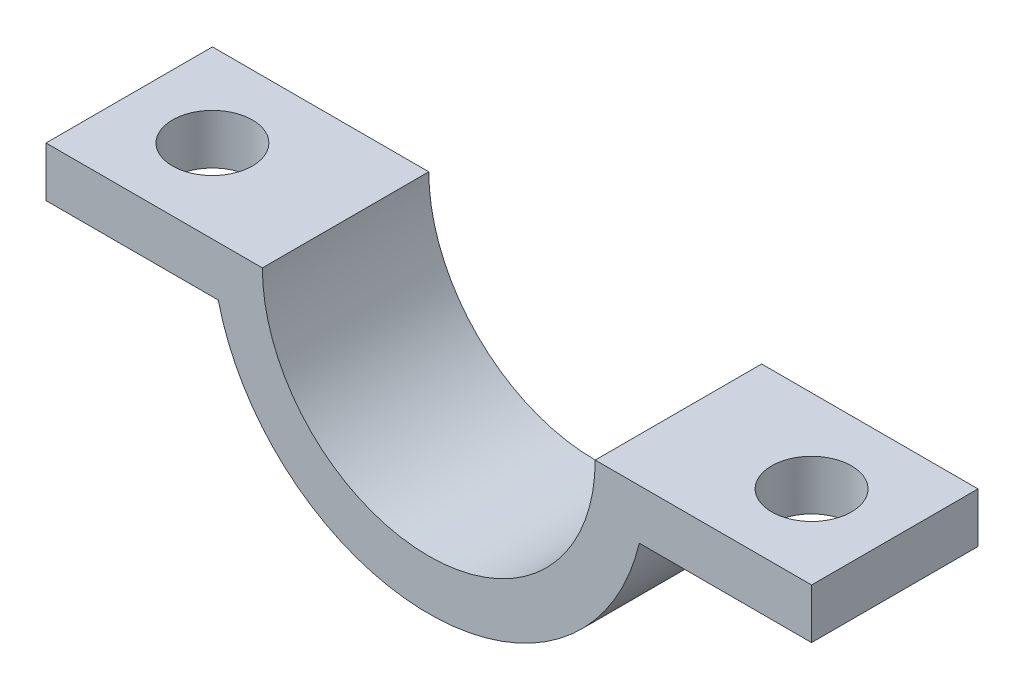
ISO-10303-21;
HEADER;
FILE_DESCRIPTION(('STEP AP214'),'2;1');
FILE_NAME('part.step','',(''),(''),'','','');
FILE_SCHEMA(('AUTOMOTIVE_DESIGN { 1 0 10303 214 1 1 1 1 }'));
ENDSEC;
DATA;
#1=APPLICATION_CONTEXT('core data for automotive mechanical design processes');
#2=APPLICATION_PROTOCOL_DEFINITION('international standard','automotive_design',2000,#1);
#3=PRODUCT_CONTEXT('',#1,'mechanical');
#4=PRODUCT('Part','Part','',(#3));
#5=PRODUCT_RELATED_PRODUCT_CATEGORY('part','',(#4));
#6=PRODUCT_DEFINITION_FORMATION('','',#4);
#7=PRODUCT_DEFINITION_CONTEXT('part definition',#1,'design');
#8=PRODUCT_DEFINITION('design','',#6,#7);
#9=PRODUCT_DEFINITION_SHAPE('','',#8);
#10=(LENGTH_UNIT() NAMED_UNIT(*) SI_UNIT(.MILLI.,.METRE.));
#11=(NAMED_UNIT(*) PLANE_ANGLE_UNIT() SI_UNIT($,.RADIAN.));
#12=(NAMED_UNIT(*) SI_UNIT($,.STERADIAN.) SOLID_ANGLE_UNIT());
#13=UNCERTAINTY_MEASURE_WITH_UNIT(LENGTH_MEASURE(1.E-05),#10,'distance_accuracy_value','');
#14=(GEOMETRIC_REPRESENTATION_CONTEXT(3) GLOBAL_UNCERTAINTY_ASSIGNED_CONTEXT((#13)) GLOBAL_UNIT_ASSIGNED_CONTEXT((#10,
#11,#12)) REPRESENTATION_CONTEXT('',''));
#15=CARTESIAN_POINT('',(0.,0.,0.));
#16=DIRECTION('',(0.,0.,1.));
#17=DIRECTION('',(1.,0.,0.));
#18=AXIS2_PLACEMENT_3D('',#15,#16,#17);
#19=CARTESIAN_POINT('',(11.5,0.,2.5));
#20=DIRECTION('',(-1.,0.,0.));
#21=DIRECTION('',(0.,0.,1.));
#22=AXIS2_PLACEMENT_3D('',#19,#20,#21);
#23=PLANE('',#22);
#24=DIRECTION('',(0.,1.,0.));
#25=VECTOR('',#24,1.);
#26=CARTESIAN_POINT('',(11.5,0.,-2.5));
#27=LINE('',#26,#25);
#28=CARTESIAN_POINT('',(11.5,-1.5,-2.5));
#29=VERTEX_POINT('',#28);
#30=CARTESIAN_POINT('',(11.5,0.,-2.5));
#31=VERTEX_POINT('',#30);
#32=EDGE_CURVE('E142',#29,#31,#27,.T.);
#33=ORIENTED_EDGE('',*,*,#32,.T.);
#34=DIRECTION('',(0.,0.,-1.));
#35=VECTOR('',#34,1.);
#36=CARTESIAN_POINT('',(11.5,0.,2.5));
#37=LINE('',#36,#35);
#38=CARTESIAN_POINT('',(11.5,0.,2.5));
#39=VERTEX_POINT('',#38);
#40=EDGE_CURVE('E11',#39,#31,#37,.T.);
#41=ORIENTED_EDGE('',*,*,#40,.F.);
#42=DIRECTION('',(0.,1.,0.));
#43=VECTOR('',#42,1.);
#44=CARTESIAN_POINT('',(11.5,0.,2.5));
#45=LINE('',#44,#43);
#46=CARTESIAN_POINT('',(11.5,-1.5,2.5));
#47=VERTEX_POINT('',#46);
#48=EDGE_CURVE('E164',#47,#39,#45,.T.);
#49=ORIENTED_EDGE('',*,*,#48,.F.);
#50=DIRECTION('',(0.,0.,-1.));
#51=VECTOR('',#50,1.);
#52=CARTESIAN_POINT('',(11.5,-1.5,2.5));
#53=LINE('',#52,#51);
#54=EDGE_CURVE('E138',#47,#29,#53,.T.);
#55=ORIENTED_EDGE('',*,*,#54,.T.);
#56=EDGE_LOOP('',(#33,#41,#49,#55));
#57=FACE_BOUND('',#56,.T.);
#58=ADVANCED_FACE('F39',(#57),#23,.F.);
#59=CARTESIAN_POINT('',(5.,0.,2.5));
#60=DIRECTION('',(0.,-1.,0.));
#61=DIRECTION('',(0.,0.,-1.));
#62=AXIS2_PLACEMENT_3D('',#59,#60,#61);
#63=PLANE('',#62);
#64=CARTESIAN_POINT('',(9.,0.,0.));
#65=DIRECTION('',(0.,1.,0.));
#66=DIRECTION('',(0.,0.,-1.));
#67=AXIS2_PLACEMENT_3D('',#64,#65,#66);
#68=CIRCLE('',#67,1.2);
#69=CARTESIAN_POINT('',(9.,0.,-1.2));
#70=VERTEX_POINT('',#69);
#71=EDGE_CURVE('E191',#70,#70,#68,.T.);
#72=ORIENTED_EDGE('',*,*,#71,.F.);
#73=EDGE_LOOP('',(#72));
#74=FACE_BOUND('',#73,.T.);
#75=DIRECTION('',(-1.,0.,0.));
#76=VECTOR('',#75,1.);
#77=CARTESIAN_POINT('',(5.,0.,-2.5));
#78=LINE('',#77,#76);
#79=CARTESIAN_POINT('',(5.,0.,-2.5));
#80=VERTEX_POINT('',#79);
#81=EDGE_CURVE('E146',#31,#80,#78,.T.);
#82=ORIENTED_EDGE('',*,*,#81,.T.);
#83=DIRECTION('',(0.,0.,-1.));
#84=VECTOR('',#83,1.);
#85=CARTESIAN_POINT('',(5.,0.,2.5));
#86=LINE('',#85,#84);
#87=CARTESIAN_POINT('',(5.,0.,2.5));
#88=VERTEX_POINT('',#87);
#89=EDGE_CURVE('E49',#88,#80,#86,.T.);
#90=ORIENTED_EDGE('',*,*,#89,.F.);
#91=DIRECTION('',(-1.,0.,0.));
#92=VECTOR('',#91,1.);
#93=CARTESIAN_POINT('',(5.,0.,2.5));
#94=LINE('',#93,#92);
#95=EDGE_CURVE('E101',#39,#88,#94,.T.);
#96=ORIENTED_EDGE('',*,*,#95,.F.);
#97=ORIENTED_EDGE('',*,*,#40,.T.);
#98=EDGE_LOOP('',(#82,#90,#96,#97));
#99=FACE_BOUND('',#98,.T.);
#100=ADVANCED_FACE('F237',(#74,#99),#63,.F.);
#101=CARTESIAN_POINT('',(0.,0.,2.5));
#102=DIRECTION('',(0.,0.,-1.));
#103=DIRECTION('',(-1.,0.,0.));
#104=AXIS2_PLACEMENT_3D('',#101,#102,#103);
#105=CYLINDRICAL_SURFACE('',#104,5.);
#106=CARTESIAN_POINT('',(0.,0.,-2.5));
#107=DIRECTION('',(0.,0.,-1.));
#108=DIRECTION('',(1.,0.,0.));
#109=AXIS2_PLACEMENT_3D('',#106,#107,#108);
#110=CIRCLE('',#109,5.);
#111=CARTESIAN_POINT('',(-5.,0.,-2.5));
#112=VERTEX_POINT('',#111);
#113=EDGE_CURVE('E149',#80,#112,#110,.T.);
#114=ORIENTED_EDGE('',*,*,#113,.T.);
#115=DIRECTION('',(0.,0.,-1.));
#116=VECTOR('',#115,1.);
#117=CARTESIAN_POINT('',(-5.,0.,2.5));
#118=LINE('',#117,#116);
#119=CARTESIAN_POINT('',(-5.,0.,2.5));
#120=VERTEX_POINT('',#119);
#121=EDGE_CURVE('E175',#120,#112,#118,.T.);
#122=ORIENTED_EDGE('',*,*,#121,.F.);
#123=CARTESIAN_POINT('',(0.,0.,2.5));
#124=DIRECTION('',(0.,0.,-1.));
#125=DIRECTION('',(1.,0.,0.));
#126=AXIS2_PLACEMENT_3D('',#123,#124,#125);
#127=CIRCLE('',#126,5.);
#128=EDGE_CURVE('E203',#88,#120,#127,.T.);
#129=ORIENTED_EDGE('',*,*,#128,.F.);
#130=ORIENTED_EDGE('',*,*,#89,.T.);
#131=EDGE_LOOP('',(#114,#122,#129,#130));
#132=FACE_BOUND('',#131,.T.);
#133=ADVANCED_FACE('F241',(#132),#105,.F.);
#134=CARTESIAN_POINT('',(-5.,0.,2.5));
#135=DIRECTION('',(0.,-1.,0.));
#136=DIRECTION('',(0.,0.,-1.));
#137=AXIS2_PLACEMENT_3D('',#134,#135,#136);
#138=PLANE('',#137);
#139=CARTESIAN_POINT('',(-9.,0.,0.));
#140=DIRECTION('',(0.,1.,0.));
#141=DIRECTION('',(0.,0.,1.));
#142=AXIS2_PLACEMENT_3D('',#139,#140,#141);
#143=CIRCLE('',#142,1.2);
#144=CARTESIAN_POINT('',(-9.,0.,1.2));
#145=VERTEX_POINT('',#144);
#146=EDGE_CURVE('E184',#145,#145,#143,.T.);
#147=ORIENTED_EDGE('',*,*,#146,.F.);
#148=EDGE_LOOP('',(#147));
#149=FACE_BOUND('',#148,.T.);
#150=DIRECTION('',(-1.,0.,0.));
#151=VECTOR('',#150,1.);
#152=CARTESIAN_POINT('',(-5.,0.,-2.5));
#153=LINE('',#152,#151);
#154=CARTESIAN_POINT('',(-11.5,0.,-2.5));
#155=VERTEX_POINT('',#154);
#156=EDGE_CURVE('E152',#112,#155,#153,.T.);
#157=ORIENTED_EDGE('',*,*,#156,.T.);
#158=DIRECTION('',(0.,0.,-1.));
#159=VECTOR('',#158,1.);
#160=CARTESIAN_POINT('',(-11.5,0.,2.5));
#161=LINE('',#160,#159);
#162=CARTESIAN_POINT('',(-11.5,0.,2.5));
#163=VERTEX_POINT('',#162);
#164=EDGE_CURVE('E171',#163,#155,#161,.T.);
#165=ORIENTED_EDGE('',*,*,#164,.F.);
#166=DIRECTION('',(-1.,0.,0.));
#167=VECTOR('',#166,1.);
#168=CARTESIAN_POINT('',(-5.,0.,2.5));
#169=LINE('',#168,#167);
#170=EDGE_CURVE('E206',#120,#163,#169,.T.);
#171=ORIENTED_EDGE('',*,*,#170,.F.);
#172=ORIENTED_EDGE('',*,*,#121,.T.);
#173=EDGE_LOOP('',(#157,#165,#171,#172));
#174=FACE_BOUND('',#173,.T.);
#175=ADVANCED_FACE('F214',(#149,#174),#138,.F.);
#176=CARTESIAN_POINT('',(-11.5,0.,2.5));
#177=DIRECTION('',(1.,0.,0.));
#178=DIRECTION('',(0.,0.,-1.));
#179=AXIS2_PLACEMENT_3D('',#176,#177,#178);
#180=PLANE('',#179);
#181=DIRECTION('',(0.,-1.,0.));
#182=VECTOR('',#181,1.);
#183=CARTESIAN_POINT('',(-11.5,0.,-2.5));
#184=LINE('',#183,#182);
#185=CARTESIAN_POINT('',(-11.5,-1.5,-2.5));
#186=VERTEX_POINT('',#185);
#187=EDGE_CURVE('E155',#155,#186,#184,.T.);
#188=ORIENTED_EDGE('',*,*,#187,.T.);
#189=DIRECTION('',(0.,0.,-1.));
#190=VECTOR('',#189,1.);
#191=CARTESIAN_POINT('',(-11.5,-1.5,2.5));
#192=LINE('',#191,#190);
#193=CARTESIAN_POINT('',(-11.5,-1.5,2.5));
#194=VERTEX_POINT('',#193);
#195=EDGE_CURVE('E131',#194,#186,#192,.T.);
#196=ORIENTED_EDGE('',*,*,#195,.F.);
#197=DIRECTION('',(0.,-1.,0.));
#198=VECTOR('',#197,1.);
#199=CARTESIAN_POINT('',(-11.5,0.,2.5));
#200=LINE('',#199,#198);
#201=EDGE_CURVE('E120',#163,#194,#200,.T.);
#202=ORIENTED_EDGE('',*,*,#201,.F.);
#203=ORIENTED_EDGE('',*,*,#164,.T.);
#204=EDGE_LOOP('',(#188,#196,#202,#203));
#205=FACE_BOUND('',#204,.T.);
#206=ADVANCED_FACE('F218',(#205),#180,.F.);
#207=CARTESIAN_POINT('',(-11.5,-1.5,2.5));
#208=DIRECTION('',(0.,1.,0.));
#209=DIRECTION('',(-1.,0.,0.));
#210=AXIS2_PLACEMENT_3D('',#207,#208,#209);
#211=PLANE('',#210);
#212=CARTESIAN_POINT('',(-9.,-1.5,0.));
#213=DIRECTION('',(0.,1.,0.));
#214=DIRECTION('',(-1.,0.,0.));
#215=AXIS2_PLACEMENT_3D('',#212,#213,#214);
#216=CIRCLE('',#215,1.2);
#217=CARTESIAN_POINT('',(-10.2,-1.5,0.));
#218=VERTEX_POINT('',#217);
#219=EDGE_CURVE('E42',#218,#218,#216,.T.);
#220=ORIENTED_EDGE('',*,*,#219,.T.);
#221=EDGE_LOOP('',(#220));
#222=FACE_BOUND('',#221,.T.);
#223=DIRECTION('',(1.,0.,0.));
#224=VECTOR('',#223,1.);
#225=CARTESIAN_POINT('',(-11.5,-1.5,-2.5));
#226=LINE('',#225,#224);
#227=CARTESIAN_POINT('',(-6.32455532033676,-1.5,-2.5));
#228=VERTEX_POINT('',#227);
#229=EDGE_CURVE('E129',#186,#228,#226,.T.);
#230=ORIENTED_EDGE('',*,*,#229,.T.);
#231=DIRECTION('',(0.,0.,-1.));
#232=VECTOR('',#231,1.);
#233=CARTESIAN_POINT('',(-6.32455532033676,-1.5,2.5));
#234=LINE('',#233,#232);
#235=CARTESIAN_POINT('',(-6.32455532033676,-1.5,2.5));
#236=VERTEX_POINT('',#235);
#237=EDGE_CURVE('E126',#236,#228,#234,.T.);
#238=ORIENTED_EDGE('',*,*,#237,.F.);
#239=DIRECTION('',(1.,0.,0.));
#240=VECTOR('',#239,1.);
#241=CARTESIAN_POINT('',(-11.5,-1.5,2.5));
#242=LINE('',#241,#240);
#243=EDGE_CURVE('E114',#194,#236,#242,.T.);
#244=ORIENTED_EDGE('',*,*,#243,.F.);
#245=ORIENTED_EDGE('',*,*,#195,.T.);
#246=EDGE_LOOP('',(#230,#238,#244,#245));
#247=FACE_BOUND('',#246,.T.);
#248=ADVANCED_FACE('F127',(#222,#247),#211,.F.);
#249=CARTESIAN_POINT('',(0.,0.,2.5));
#250=DIRECTION('',(0.,0.,-1.));
#251=DIRECTION('',(-1.,0.,0.));
#252=AXIS2_PLACEMENT_3D('',#249,#250,#251);
#253=CYLINDRICAL_SURFACE('',#252,6.5);
#254=CARTESIAN_POINT('',(0.,0.,-2.5));
#255=DIRECTION('',(0.,0.,1.));
#256=DIRECTION('',(1.,0.,0.));
#257=AXIS2_PLACEMENT_3D('',#254,#255,#256);
#258=CIRCLE('',#257,6.5);
#259=CARTESIAN_POINT('',(6.32455532033676,-1.5,-2.5));
#260=VERTEX_POINT('',#259);
#261=EDGE_CURVE('E87',#228,#260,#258,.T.);
#262=ORIENTED_EDGE('',*,*,#261,.T.);
#263=DIRECTION('',(0.,0.,-1.));
#264=VECTOR('',#263,1.);
#265=CARTESIAN_POINT('',(6.32455532033676,-1.5,2.5));
#266=LINE('',#265,#264);
#267=CARTESIAN_POINT('',(6.32455532033676,-1.5,2.5));
#268=VERTEX_POINT('',#267);
#269=EDGE_CURVE('E132',#268,#260,#266,.T.);
#270=ORIENTED_EDGE('',*,*,#269,.F.);
#271=CARTESIAN_POINT('',(0.,0.,2.5));
#272=DIRECTION('',(0.,0.,1.));
#273=DIRECTION('',(1.,0.,0.));
#274=AXIS2_PLACEMENT_3D('',#271,#272,#273);
#275=CIRCLE('',#274,6.5);
#276=EDGE_CURVE('E118',#236,#268,#275,.T.);
#277=ORIENTED_EDGE('',*,*,#276,.F.);
#278=ORIENTED_EDGE('',*,*,#237,.T.);
#279=EDGE_LOOP('',(#262,#270,#277,#278));
#280=FACE_BOUND('',#279,.T.);
#281=ADVANCED_FACE('F134',(#280),#253,.T.);
#282=CARTESIAN_POINT('',(11.5,-1.5,2.5));
#283=DIRECTION('',(0.,1.,0.));
#284=DIRECTION('',(-1.,0.,0.));
#285=AXIS2_PLACEMENT_3D('',#282,#283,#284);
#286=PLANE('',#285);
#287=CARTESIAN_POINT('',(9.,-1.5,0.));
#288=DIRECTION('',(0.,1.,0.));
#289=DIRECTION('',(-1.,0.,0.));
#290=AXIS2_PLACEMENT_3D('',#287,#288,#289);
#291=CIRCLE('',#290,1.2);
#292=CARTESIAN_POINT('',(7.8,-1.5,0.));
#293=VERTEX_POINT('',#292);
#294=EDGE_CURVE('E181',#293,#293,#291,.T.);
#295=ORIENTED_EDGE('',*,*,#294,.T.);
#296=EDGE_LOOP('',(#295));
#297=FACE_BOUND('',#296,.T.);
#298=DIRECTION('',(1.,0.,0.));
#299=VECTOR('',#298,1.);
#300=CARTESIAN_POINT('',(11.5,-1.5,-2.5));
#301=LINE('',#300,#299);
#302=EDGE_CURVE('E93',#260,#29,#301,.T.);
#303=ORIENTED_EDGE('',*,*,#302,.T.);
#304=ORIENTED_EDGE('',*,*,#54,.F.);
#305=DIRECTION('',(1.,0.,0.));
#306=VECTOR('',#305,1.);
#307=CARTESIAN_POINT('',(11.5,-1.5,2.5));
#308=LINE('',#307,#306);
#309=EDGE_CURVE('E58',#268,#47,#308,.T.);
#310=ORIENTED_EDGE('',*,*,#309,.F.);
#311=ORIENTED_EDGE('',*,*,#269,.T.);
#312=EDGE_LOOP('',(#303,#304,#310,#311));
#313=FACE_BOUND('',#312,.T.);
#314=ADVANCED_FACE('F226',(#297,#313),#286,.F.);
#315=CARTESIAN_POINT('',(0.,0.,2.5));
#316=DIRECTION('',(0.,0.,1.));
#317=DIRECTION('',(1.,0.,0.));
#318=AXIS2_PLACEMENT_3D('',#315,#316,#317);
#319=PLANE('',#318);
#320=ORIENTED_EDGE('',*,*,#48,.T.);
#321=ORIENTED_EDGE('',*,*,#95,.T.);
#322=ORIENTED_EDGE('',*,*,#128,.T.);
#323=ORIENTED_EDGE('',*,*,#170,.T.);
#324=ORIENTED_EDGE('',*,*,#201,.T.);
#325=ORIENTED_EDGE('',*,*,#243,.T.);
#326=ORIENTED_EDGE('',*,*,#276,.T.);
#327=ORIENTED_EDGE('',*,*,#309,.T.);
#328=EDGE_LOOP('',(#320,#321,#322,#323,#324,#325,#326,#327));
#329=FACE_BOUND('',#328,.T.);
#330=ADVANCED_FACE('F116',(#329),#319,.T.);
#331=CARTESIAN_POINT('',(0.,0.,-2.5));
#332=DIRECTION('',(0.,0.,1.));
#333=DIRECTION('',(1.,0.,0.));
#334=AXIS2_PLACEMENT_3D('',#331,#332,#333);
#335=PLANE('',#334);
#336=ORIENTED_EDGE('',*,*,#32,.F.);
#337=ORIENTED_EDGE('',*,*,#302,.F.);
#338=ORIENTED_EDGE('',*,*,#261,.F.);
#339=ORIENTED_EDGE('',*,*,#229,.F.);
#340=ORIENTED_EDGE('',*,*,#187,.F.);
#341=ORIENTED_EDGE('',*,*,#156,.F.);
#342=ORIENTED_EDGE('',*,*,#113,.F.);
#343=ORIENTED_EDGE('',*,*,#81,.F.);
#344=EDGE_LOOP('',(#336,#337,#338,#339,#340,#341,#342,#343));
#345=FACE_BOUND('',#344,.T.);
#346=ADVANCED_FACE('F221',(#345),#335,.F.);
#347=CARTESIAN_POINT('',(9.,-6.5,0.));
#348=DIRECTION('',(0.,1.,0.));
#349=DIRECTION('',(0.,0.,1.));
#350=AXIS2_PLACEMENT_3D('',#347,#348,#349);
#351=CYLINDRICAL_SURFACE('',#350,1.2);
#352=ORIENTED_EDGE('',*,*,#71,.T.);
#353=EDGE_LOOP('',(#352));
#354=FACE_BOUND('',#353,.T.);
#355=ORIENTED_EDGE('',*,*,#294,.F.);
#356=EDGE_LOOP('',(#355));
#357=FACE_BOUND('',#356,.T.);
#358=ADVANCED_FACE('F263',(#354,#357),#351,.F.);
#359=CARTESIAN_POINT('',(-9.,-6.5,0.));
#360=DIRECTION('',(0.,1.,0.));
#361=DIRECTION('',(0.,0.,1.));
#362=AXIS2_PLACEMENT_3D('',#359,#360,#361);
#363=CYLINDRICAL_SURFACE('',#362,1.2);
#364=ORIENTED_EDGE('',*,*,#146,.T.);
#365=EDGE_LOOP('',(#364));
#366=FACE_BOUND('',#365,.T.);
#367=ORIENTED_EDGE('',*,*,#219,.F.);
#368=EDGE_LOOP('',(#367));
#369=FACE_BOUND('',#368,.T.);
#370=ADVANCED_FACE('F261',(#366,#369),#363,.F.);
#371=CLOSED_SHELL('',(#58,#100,#133,#175,#206,#248,#281,#314,#330,#346,#358,#370));
#372=MANIFOLD_SOLID_BREP('B2',#371);
#373=ADVANCED_BREP_SHAPE_REPRESENTATION('',(#18,#372),#14);
#374=SHAPE_DEFINITION_REPRESENTATION(#9,#373);
ENDSEC;
END-ISO-10303-21;
